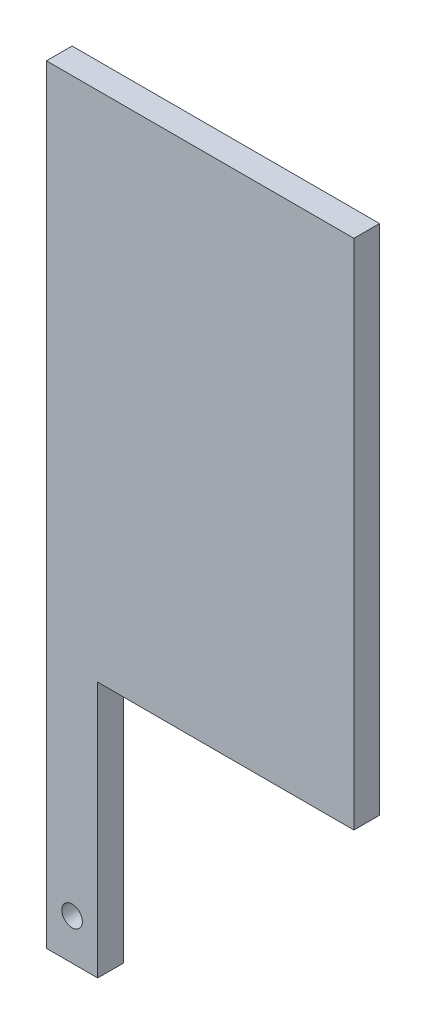
ISO-10303-21;
HEADER;
FILE_DESCRIPTION(('STEP AP214'),'2;1');
FILE_NAME('part.step','',(''),(''),'','','');
FILE_SCHEMA(('AUTOMOTIVE_DESIGN { 1 0 10303 214 1 1 1 1 }'));
ENDSEC;
DATA;
#1=APPLICATION_CONTEXT('core data for automotive mechanical design processes');
#2=APPLICATION_PROTOCOL_DEFINITION('international standard','automotive_design',2000,#1);
#3=PRODUCT_CONTEXT('',#1,'mechanical');
#4=PRODUCT('Part','Part','',(#3));
#5=PRODUCT_RELATED_PRODUCT_CATEGORY('part','',(#4));
#6=PRODUCT_DEFINITION_FORMATION('','',#4);
#7=PRODUCT_DEFINITION_CONTEXT('part definition',#1,'design');
#8=PRODUCT_DEFINITION('design','',#6,#7);
#9=PRODUCT_DEFINITION_SHAPE('','',#8);
#10=(LENGTH_UNIT() NAMED_UNIT(*) SI_UNIT(.MILLI.,.METRE.));
#11=(NAMED_UNIT(*) PLANE_ANGLE_UNIT() SI_UNIT($,.RADIAN.));
#12=(NAMED_UNIT(*) SI_UNIT($,.STERADIAN.) SOLID_ANGLE_UNIT());
#13=UNCERTAINTY_MEASURE_WITH_UNIT(LENGTH_MEASURE(1.E-05),#10,'distance_accuracy_value','');
#14=(GEOMETRIC_REPRESENTATION_CONTEXT(3) GLOBAL_UNCERTAINTY_ASSIGNED_CONTEXT((#13)) GLOBAL_UNIT_ASSIGNED_CONTEXT((#10,
#11,#12)) REPRESENTATION_CONTEXT('',''));
#15=CARTESIAN_POINT('',(0.,0.,0.));
#16=DIRECTION('',(0.,0.,1.));
#17=DIRECTION('',(1.,0.,0.));
#18=AXIS2_PLACEMENT_3D('',#15,#16,#17);
#19=CARTESIAN_POINT('',(0.,-150.,5.));
#20=DIRECTION('',(0.,1.,0.));
#21=DIRECTION('',(0.,0.,1.));
#22=AXIS2_PLACEMENT_3D('',#19,#20,#21);
#23=PLANE('',#22);
#24=DIRECTION('',(1.,0.,0.));
#25=VECTOR('',#24,1.);
#26=CARTESIAN_POINT('',(0.,-150.,0.));
#27=LINE('',#26,#25);
#28=CARTESIAN_POINT('',(0.,-150.,0.));
#29=VERTEX_POINT('',#28);
#30=CARTESIAN_POINT('',(10.,-150.,0.));
#31=VERTEX_POINT('',#30);
#32=EDGE_CURVE('E124',#29,#31,#27,.T.);
#33=ORIENTED_EDGE('',*,*,#32,.T.);
#34=DIRECTION('',(0.,0.,-1.));
#35=VECTOR('',#34,1.);
#36=CARTESIAN_POINT('',(10.,-150.,5.));
#37=LINE('',#36,#35);
#38=CARTESIAN_POINT('',(10.,-150.,5.));
#39=VERTEX_POINT('',#38);
#40=EDGE_CURVE('E11',#39,#31,#37,.T.);
#41=ORIENTED_EDGE('',*,*,#40,.F.);
#42=DIRECTION('',(1.,0.,0.));
#43=VECTOR('',#42,1.);
#44=CARTESIAN_POINT('',(0.,-150.,5.));
#45=LINE('',#44,#43);
#46=CARTESIAN_POINT('',(0.,-150.,5.));
#47=VERTEX_POINT('',#46);
#48=EDGE_CURVE('E126',#47,#39,#45,.T.);
#49=ORIENTED_EDGE('',*,*,#48,.F.);
#50=DIRECTION('',(0.,0.,-1.));
#51=VECTOR('',#50,1.);
#52=CARTESIAN_POINT('',(0.,-150.,5.));
#53=LINE('',#52,#51);
#54=EDGE_CURVE('E134',#47,#29,#53,.T.);
#55=ORIENTED_EDGE('',*,*,#54,.T.);
#56=EDGE_LOOP('',(#33,#41,#49,#55));
#57=FACE_BOUND('',#56,.T.);
#58=ADVANCED_FACE('F37',(#57),#23,.F.);
#59=CARTESIAN_POINT('',(10.,0.,5.));
#60=DIRECTION('',(-1.,0.,0.));
#61=DIRECTION('',(0.,-1.,0.));
#62=AXIS2_PLACEMENT_3D('',#59,#60,#61);
#63=PLANE('',#62);
#64=DIRECTION('',(0.,1.,0.));
#65=VECTOR('',#64,1.);
#66=CARTESIAN_POINT('',(10.,0.,0.));
#67=LINE('',#66,#65);
#68=CARTESIAN_POINT('',(10.,-100.,0.));
#69=VERTEX_POINT('',#68);
#70=EDGE_CURVE('E137',#31,#69,#67,.T.);
#71=ORIENTED_EDGE('',*,*,#70,.T.);
#72=DIRECTION('',(0.,0.,-1.));
#73=VECTOR('',#72,1.);
#74=CARTESIAN_POINT('',(10.,-100.,5.));
#75=LINE('',#74,#73);
#76=CARTESIAN_POINT('',(10.,-100.,5.));
#77=VERTEX_POINT('',#76);
#78=EDGE_CURVE('E45',#77,#69,#75,.T.);
#79=ORIENTED_EDGE('',*,*,#78,.F.);
#80=DIRECTION('',(0.,1.,0.));
#81=VECTOR('',#80,1.);
#82=CARTESIAN_POINT('',(10.,0.,5.));
#83=LINE('',#82,#81);
#84=EDGE_CURVE('E86',#39,#77,#83,.T.);
#85=ORIENTED_EDGE('',*,*,#84,.F.);
#86=ORIENTED_EDGE('',*,*,#40,.T.);
#87=EDGE_LOOP('',(#71,#79,#85,#86));
#88=FACE_BOUND('',#87,.T.);
#89=ADVANCED_FACE('F147',(#88),#63,.F.);
#90=CARTESIAN_POINT('',(0.,-100.,5.));
#91=DIRECTION('',(0.,1.,0.));
#92=DIRECTION('',(0.,0.,1.));
#93=AXIS2_PLACEMENT_3D('',#90,#91,#92);
#94=PLANE('',#93);
#95=DIRECTION('',(1.,0.,0.));
#96=VECTOR('',#95,1.);
#97=CARTESIAN_POINT('',(0.,-100.,0.));
#98=LINE('',#97,#96);
#99=CARTESIAN_POINT('',(60.,-100.,0.));
#100=VERTEX_POINT('',#99);
#101=EDGE_CURVE('E105',#69,#100,#98,.T.);
#102=ORIENTED_EDGE('',*,*,#101,.T.);
#103=DIRECTION('',(0.,0.,-1.));
#104=VECTOR('',#103,1.);
#105=CARTESIAN_POINT('',(60.,-100.,5.));
#106=LINE('',#105,#104);
#107=CARTESIAN_POINT('',(60.,-100.,5.));
#108=VERTEX_POINT('',#107);
#109=EDGE_CURVE('E72',#108,#100,#106,.T.);
#110=ORIENTED_EDGE('',*,*,#109,.F.);
#111=DIRECTION('',(1.,0.,0.));
#112=VECTOR('',#111,1.);
#113=CARTESIAN_POINT('',(0.,-100.,5.));
#114=LINE('',#113,#112);
#115=EDGE_CURVE('E129',#77,#108,#114,.T.);
#116=ORIENTED_EDGE('',*,*,#115,.F.);
#117=ORIENTED_EDGE('',*,*,#78,.T.);
#118=EDGE_LOOP('',(#102,#110,#116,#117));
#119=FACE_BOUND('',#118,.T.);
#120=ADVANCED_FACE('F145',(#119),#94,.F.);
#121=CARTESIAN_POINT('',(60.,0.,5.));
#122=DIRECTION('',(1.,0.,0.));
#123=DIRECTION('',(0.,0.,-1.));
#124=AXIS2_PLACEMENT_3D('',#121,#122,#123);
#125=PLANE('',#124);
#126=DIRECTION('',(0.,-1.,0.));
#127=VECTOR('',#126,1.);
#128=CARTESIAN_POINT('',(60.,0.,0.));
#129=LINE('',#128,#127);
#130=CARTESIAN_POINT('',(60.,0.,0.));
#131=VERTEX_POINT('',#130);
#132=EDGE_CURVE('E97',#131,#100,#129,.T.);
#133=ORIENTED_EDGE('',*,*,#132,.F.);
#134=DIRECTION('',(0.,0.,1.));
#135=VECTOR('',#134,1.);
#136=CARTESIAN_POINT('',(60.,0.,0.));
#137=LINE('',#136,#135);
#138=CARTESIAN_POINT('',(60.,0.,5.));
#139=VERTEX_POINT('',#138);
#140=EDGE_CURVE('E100',#131,#139,#137,.T.);
#141=ORIENTED_EDGE('',*,*,#140,.T.);
#142=DIRECTION('',(0.,-1.,0.));
#143=VECTOR('',#142,1.);
#144=CARTESIAN_POINT('',(60.,0.,5.));
#145=LINE('',#144,#143);
#146=EDGE_CURVE('E131',#139,#108,#145,.T.);
#147=ORIENTED_EDGE('',*,*,#146,.T.);
#148=ORIENTED_EDGE('',*,*,#109,.T.);
#149=EDGE_LOOP('',(#133,#141,#147,#148));
#150=FACE_BOUND('',#149,.T.);
#151=ADVANCED_FACE('F99',(#150),#125,.T.);
#152=CARTESIAN_POINT('',(0.,0.,5.));
#153=DIRECTION('',(1.,0.,0.));
#154=DIRECTION('',(0.,1.,0.));
#155=AXIS2_PLACEMENT_3D('',#152,#153,#154);
#156=PLANE('',#155);
#157=DIRECTION('',(0.,-1.,0.));
#158=VECTOR('',#157,1.);
#159=CARTESIAN_POINT('',(0.,0.,0.));
#160=LINE('',#159,#158);
#161=CARTESIAN_POINT('',(0.,0.,0.));
#162=VERTEX_POINT('',#161);
#163=EDGE_CURVE('E79',#162,#29,#160,.T.);
#164=ORIENTED_EDGE('',*,*,#163,.T.);
#165=ORIENTED_EDGE('',*,*,#54,.F.);
#166=DIRECTION('',(0.,-1.,0.));
#167=VECTOR('',#166,1.);
#168=CARTESIAN_POINT('',(0.,0.,5.));
#169=LINE('',#168,#167);
#170=CARTESIAN_POINT('',(0.,0.,5.));
#171=VERTEX_POINT('',#170);
#172=EDGE_CURVE('E53',#171,#47,#169,.T.);
#173=ORIENTED_EDGE('',*,*,#172,.F.);
#174=DIRECTION('',(0.,0.,1.));
#175=VECTOR('',#174,1.);
#176=CARTESIAN_POINT('',(0.,0.,0.));
#177=LINE('',#176,#175);
#178=EDGE_CURVE('E113',#162,#171,#177,.T.);
#179=ORIENTED_EDGE('',*,*,#178,.F.);
#180=EDGE_LOOP('',(#164,#165,#173,#179));
#181=FACE_BOUND('',#180,.T.);
#182=ADVANCED_FACE('F150',(#181),#156,.F.);
#183=CARTESIAN_POINT('',(0.,0.,5.));
#184=DIRECTION('',(0.,0.,1.));
#185=DIRECTION('',(1.,0.,0.));
#186=AXIS2_PLACEMENT_3D('',#183,#184,#185);
#187=PLANE('',#186);
#188=CARTESIAN_POINT('',(5.,-142.,5.));
#189=DIRECTION('',(0.,0.,1.));
#190=DIRECTION('',(1.,0.,0.));
#191=AXIS2_PLACEMENT_3D('',#188,#189,#190);
#192=CIRCLE('',#191,2.);
#193=CARTESIAN_POINT('',(7.,-142.,5.));
#194=VERTEX_POINT('',#193);
#195=EDGE_CURVE('E121',#194,#194,#192,.T.);
#196=ORIENTED_EDGE('',*,*,#195,.F.);
#197=EDGE_LOOP('',(#196));
#198=FACE_BOUND('',#197,.T.);
#199=ORIENTED_EDGE('',*,*,#48,.T.);
#200=ORIENTED_EDGE('',*,*,#84,.T.);
#201=ORIENTED_EDGE('',*,*,#115,.T.);
#202=ORIENTED_EDGE('',*,*,#146,.F.);
#203=DIRECTION('',(-1.,0.,0.));
#204=VECTOR('',#203,1.);
#205=CARTESIAN_POINT('',(0.,0.,5.));
#206=LINE('',#205,#204);
#207=EDGE_CURVE('E112',#139,#171,#206,.T.);
#208=ORIENTED_EDGE('',*,*,#207,.T.);
#209=ORIENTED_EDGE('',*,*,#172,.T.);
#210=EDGE_LOOP('',(#199,#200,#201,#202,#208,#209));
#211=FACE_BOUND('',#210,.T.);
#212=ADVANCED_FACE('F151',(#198,#211),#187,.T.);
#213=CARTESIAN_POINT('',(0.,0.,0.));
#214=DIRECTION('',(0.,0.,1.));
#215=DIRECTION('',(1.,0.,0.));
#216=AXIS2_PLACEMENT_3D('',#213,#214,#215);
#217=PLANE('',#216);
#218=CARTESIAN_POINT('',(5.,-142.,0.));
#219=DIRECTION('',(0.,0.,1.));
#220=DIRECTION('',(1.,0.,0.));
#221=AXIS2_PLACEMENT_3D('',#218,#219,#220);
#222=CIRCLE('',#221,2.);
#223=CARTESIAN_POINT('',(7.,-142.,0.));
#224=VERTEX_POINT('',#223);
#225=EDGE_CURVE('E118',#224,#224,#222,.T.);
#226=ORIENTED_EDGE('',*,*,#225,.T.);
#227=EDGE_LOOP('',(#226));
#228=FACE_BOUND('',#227,.T.);
#229=ORIENTED_EDGE('',*,*,#32,.F.);
#230=ORIENTED_EDGE('',*,*,#163,.F.);
#231=DIRECTION('',(-1.,0.,0.));
#232=VECTOR('',#231,1.);
#233=CARTESIAN_POINT('',(0.,0.,0.));
#234=LINE('',#233,#232);
#235=EDGE_CURVE('E111',#131,#162,#234,.T.);
#236=ORIENTED_EDGE('',*,*,#235,.F.);
#237=ORIENTED_EDGE('',*,*,#132,.T.);
#238=ORIENTED_EDGE('',*,*,#101,.F.);
#239=ORIENTED_EDGE('',*,*,#70,.F.);
#240=EDGE_LOOP('',(#229,#230,#236,#237,#238,#239));
#241=FACE_BOUND('',#240,.T.);
#242=ADVANCED_FACE('F116',(#228,#241),#217,.F.);
#243=CARTESIAN_POINT('',(0.,0.,0.));
#244=DIRECTION('',(0.,1.,0.));
#245=DIRECTION('',(0.,0.,1.));
#246=AXIS2_PLACEMENT_3D('',#243,#244,#245);
#247=PLANE('',#246);
#248=ORIENTED_EDGE('',*,*,#207,.F.);
#249=ORIENTED_EDGE('',*,*,#140,.F.);
#250=ORIENTED_EDGE('',*,*,#235,.T.);
#251=ORIENTED_EDGE('',*,*,#178,.T.);
#252=EDGE_LOOP('',(#248,#249,#250,#251));
#253=FACE_BOUND('',#252,.T.);
#254=ADVANCED_FACE('F109',(#253),#247,.T.);
#255=CARTESIAN_POINT('',(5.,-142.,0.));
#256=DIRECTION('',(0.,0.,1.));
#257=DIRECTION('',(1.,0.,0.));
#258=AXIS2_PLACEMENT_3D('',#255,#256,#257);
#259=CYLINDRICAL_SURFACE('',#258,2.);
#260=ORIENTED_EDGE('',*,*,#225,.F.);
#261=EDGE_LOOP('',(#260));
#262=FACE_BOUND('',#261,.T.);
#263=ORIENTED_EDGE('',*,*,#195,.T.);
#264=EDGE_LOOP('',(#263));
#265=FACE_BOUND('',#264,.T.);
#266=ADVANCED_FACE('F193',(#262,#265),#259,.F.);
#267=CLOSED_SHELL('',(#58,#89,#120,#151,#182,#212,#242,#254,#266));
#268=MANIFOLD_SOLID_BREP('B2',#267);
#269=ADVANCED_BREP_SHAPE_REPRESENTATION('',(#18,#268),#14);
#270=SHAPE_DEFINITION_REPRESENTATION(#9,#269);
ENDSEC;
END-ISO-10303-21;
